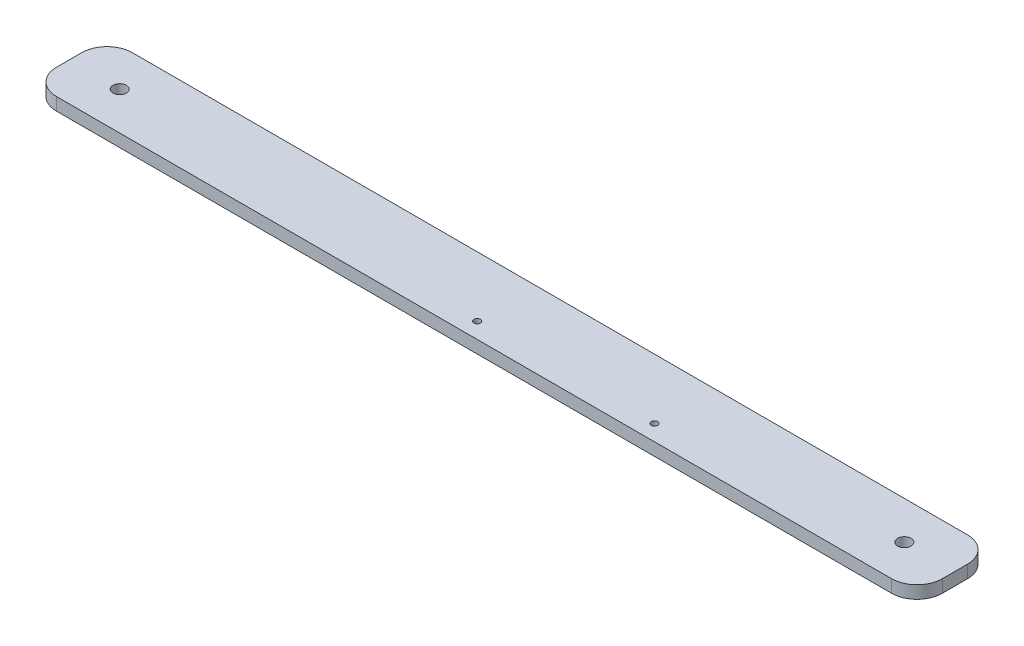
ISO-10303-21;
HEADER;
FILE_DESCRIPTION(('STEP AP214'),'2;1');
FILE_NAME('part.step','',(''),(''),'','','');
FILE_SCHEMA(('AUTOMOTIVE_DESIGN { 1 0 10303 214 1 1 1 1 }'));
ENDSEC;
DATA;
#1=APPLICATION_CONTEXT('core data for automotive mechanical design processes');
#2=APPLICATION_PROTOCOL_DEFINITION('international standard','automotive_design',2000,#1);
#3=PRODUCT_CONTEXT('',#1,'mechanical');
#4=PRODUCT('Part','Part','',(#3));
#5=PRODUCT_RELATED_PRODUCT_CATEGORY('part','',(#4));
#6=PRODUCT_DEFINITION_FORMATION('','',#4);
#7=PRODUCT_DEFINITION_CONTEXT('part definition',#1,'design');
#8=PRODUCT_DEFINITION('design','',#6,#7);
#9=PRODUCT_DEFINITION_SHAPE('','',#8);
#10=(LENGTH_UNIT() NAMED_UNIT(*) SI_UNIT(.MILLI.,.METRE.));
#11=(NAMED_UNIT(*) PLANE_ANGLE_UNIT() SI_UNIT($,.RADIAN.));
#12=(NAMED_UNIT(*) SI_UNIT($,.STERADIAN.) SOLID_ANGLE_UNIT());
#13=UNCERTAINTY_MEASURE_WITH_UNIT(LENGTH_MEASURE(1.E-05),#10,'distance_accuracy_value','');
#14=(GEOMETRIC_REPRESENTATION_CONTEXT(3) GLOBAL_UNCERTAINTY_ASSIGNED_CONTEXT((#13)) GLOBAL_UNIT_ASSIGNED_CONTEXT((#10,
#11,#12)) REPRESENTATION_CONTEXT('',''));
#15=CARTESIAN_POINT('',(0.,0.,0.));
#16=DIRECTION('',(0.,0.,1.));
#17=DIRECTION('',(1.,0.,0.));
#18=AXIS2_PLACEMENT_3D('',#15,#16,#17);
#19=CARTESIAN_POINT('',(431.8,6.35,-12.7));
#20=DIRECTION('',(0.,-1.,0.));
#21=DIRECTION('',(0.,0.,-1.));
#22=AXIS2_PLACEMENT_3D('',#19,#20,#21);
#23=CYLINDRICAL_SURFACE('',#22,12.7);
#24=DIRECTION('',(0.,-1.,0.));
#25=VECTOR('',#24,1.);
#26=CARTESIAN_POINT('',(444.5,6.35,-12.7));
#27=LINE('',#26,#25);
#28=CARTESIAN_POINT('',(444.5,6.35,-12.7));
#29=VERTEX_POINT('',#28);
#30=CARTESIAN_POINT('',(444.5,0.,-12.7));
#31=VERTEX_POINT('',#30);
#32=EDGE_CURVE('E176',#29,#31,#27,.T.);
#33=ORIENTED_EDGE('',*,*,#32,.F.);
#34=CARTESIAN_POINT('',(431.8,6.35,-12.7));
#35=DIRECTION('',(0.,-1.,0.));
#36=DIRECTION('',(0.,0.,-1.));
#37=AXIS2_PLACEMENT_3D('',#34,#35,#36);
#38=CIRCLE('',#37,12.7);
#39=CARTESIAN_POINT('',(431.8,6.35,0.));
#40=VERTEX_POINT('',#39);
#41=EDGE_CURVE('E48',#40,#29,#38,.F.);
#42=ORIENTED_EDGE('',*,*,#41,.F.);
#43=DIRECTION('',(0.,-1.,0.));
#44=VECTOR('',#43,1.);
#45=CARTESIAN_POINT('',(431.8,6.35,0.));
#46=LINE('',#45,#44);
#47=CARTESIAN_POINT('',(431.8,0.,0.));
#48=VERTEX_POINT('',#47);
#49=EDGE_CURVE('E180',#48,#40,#46,.F.);
#50=ORIENTED_EDGE('',*,*,#49,.F.);
#51=CARTESIAN_POINT('',(431.8,0.,-12.7));
#52=DIRECTION('',(0.,-1.,0.));
#53=DIRECTION('',(0.,0.,-1.));
#54=AXIS2_PLACEMENT_3D('',#51,#52,#53);
#55=CIRCLE('',#54,12.7);
#56=EDGE_CURVE('E11',#31,#48,#55,.T.);
#57=ORIENTED_EDGE('',*,*,#56,.F.);
#58=EDGE_LOOP('',(#33,#42,#50,#57));
#59=FACE_BOUND('',#58,.T.);
#60=ADVANCED_FACE('F40',(#59),#23,.T.);
#61=CARTESIAN_POINT('',(431.8,6.35,-25.4));
#62=DIRECTION('',(0.,-1.,0.));
#63=DIRECTION('',(0.,0.,-1.));
#64=AXIS2_PLACEMENT_3D('',#61,#62,#63);
#65=CYLINDRICAL_SURFACE('',#64,12.7);
#66=DIRECTION('',(0.,-1.,0.));
#67=VECTOR('',#66,1.);
#68=CARTESIAN_POINT('',(431.8,6.35,-38.1));
#69=LINE('',#68,#67);
#70=CARTESIAN_POINT('',(431.8,6.35,-38.1));
#71=VERTEX_POINT('',#70);
#72=CARTESIAN_POINT('',(431.8,0.,-38.1));
#73=VERTEX_POINT('',#72);
#74=EDGE_CURVE('E161',#71,#73,#69,.T.);
#75=ORIENTED_EDGE('',*,*,#74,.F.);
#76=CARTESIAN_POINT('',(431.8,6.35,-25.4));
#77=DIRECTION('',(0.,-1.,0.));
#78=DIRECTION('',(0.,0.,-1.));
#79=AXIS2_PLACEMENT_3D('',#76,#77,#78);
#80=CIRCLE('',#79,12.7);
#81=CARTESIAN_POINT('',(444.5,6.35,-25.4));
#82=VERTEX_POINT('',#81);
#83=EDGE_CURVE('E169',#82,#71,#80,.F.);
#84=ORIENTED_EDGE('',*,*,#83,.F.);
#85=DIRECTION('',(0.,-1.,0.));
#86=VECTOR('',#85,1.);
#87=CARTESIAN_POINT('',(444.5,6.35,-25.4));
#88=LINE('',#87,#86);
#89=CARTESIAN_POINT('',(444.5,0.,-25.4));
#90=VERTEX_POINT('',#89);
#91=EDGE_CURVE('E165',#90,#82,#88,.F.);
#92=ORIENTED_EDGE('',*,*,#91,.F.);
#93=CARTESIAN_POINT('',(431.8,0.,-25.4));
#94=DIRECTION('',(0.,-1.,0.));
#95=DIRECTION('',(0.,0.,-1.));
#96=AXIS2_PLACEMENT_3D('',#93,#94,#95);
#97=CIRCLE('',#96,12.7);
#98=EDGE_CURVE('E172',#73,#90,#97,.T.);
#99=ORIENTED_EDGE('',*,*,#98,.F.);
#100=EDGE_LOOP('',(#75,#84,#92,#99));
#101=FACE_BOUND('',#100,.T.);
#102=ADVANCED_FACE('F263',(#101),#65,.T.);
#103=CARTESIAN_POINT('',(12.7,6.35,-25.4));
#104=DIRECTION('',(0.,-1.,0.));
#105=DIRECTION('',(0.,0.,-1.));
#106=AXIS2_PLACEMENT_3D('',#103,#104,#105);
#107=CYLINDRICAL_SURFACE('',#106,12.7);
#108=DIRECTION('',(0.,-1.,0.));
#109=VECTOR('',#108,1.);
#110=CARTESIAN_POINT('',(0.,6.35,-25.4));
#111=LINE('',#110,#109);
#112=CARTESIAN_POINT('',(0.,6.35,-25.4));
#113=VERTEX_POINT('',#112);
#114=CARTESIAN_POINT('',(0.,0.,-25.4));
#115=VERTEX_POINT('',#114);
#116=EDGE_CURVE('E121',#113,#115,#111,.T.);
#117=ORIENTED_EDGE('',*,*,#116,.F.);
#118=CARTESIAN_POINT('',(12.7,6.35,-25.4));
#119=DIRECTION('',(0.,-1.,0.));
#120=DIRECTION('',(0.,0.,-1.));
#121=AXIS2_PLACEMENT_3D('',#118,#119,#120);
#122=CIRCLE('',#121,12.7);
#123=CARTESIAN_POINT('',(12.7,6.35,-38.1));
#124=VERTEX_POINT('',#123);
#125=EDGE_CURVE('E156',#124,#113,#122,.F.);
#126=ORIENTED_EDGE('',*,*,#125,.F.);
#127=DIRECTION('',(0.,-1.,0.));
#128=VECTOR('',#127,1.);
#129=CARTESIAN_POINT('',(12.7,6.35,-38.1));
#130=LINE('',#129,#128);
#131=CARTESIAN_POINT('',(12.7,0.,-38.1));
#132=VERTEX_POINT('',#131);
#133=EDGE_CURVE('E153',#132,#124,#130,.F.);
#134=ORIENTED_EDGE('',*,*,#133,.F.);
#135=CARTESIAN_POINT('',(12.7,0.,-25.4));
#136=DIRECTION('',(0.,-1.,0.));
#137=DIRECTION('',(0.,0.,-1.));
#138=AXIS2_PLACEMENT_3D('',#135,#136,#137);
#139=CIRCLE('',#138,12.7);
#140=EDGE_CURVE('E158',#115,#132,#139,.T.);
#141=ORIENTED_EDGE('',*,*,#140,.F.);
#142=EDGE_LOOP('',(#117,#126,#134,#141));
#143=FACE_BOUND('',#142,.T.);
#144=ADVANCED_FACE('F267',(#143),#107,.T.);
#145=CARTESIAN_POINT('',(12.7,6.35,-12.7));
#146=DIRECTION('',(0.,-1.,0.));
#147=DIRECTION('',(0.,0.,-1.));
#148=AXIS2_PLACEMENT_3D('',#145,#146,#147);
#149=CYLINDRICAL_SURFACE('',#148,12.7);
#150=DIRECTION('',(0.,-1.,0.));
#151=VECTOR('',#150,1.);
#152=CARTESIAN_POINT('',(12.7,6.35,0.));
#153=LINE('',#152,#151);
#154=CARTESIAN_POINT('',(12.7,6.35,0.));
#155=VERTEX_POINT('',#154);
#156=CARTESIAN_POINT('',(12.7,0.,0.));
#157=VERTEX_POINT('',#156);
#158=EDGE_CURVE('E116',#155,#157,#153,.T.);
#159=ORIENTED_EDGE('',*,*,#158,.F.);
#160=CARTESIAN_POINT('',(12.7,6.35,-12.7));
#161=DIRECTION('',(0.,-1.,0.));
#162=DIRECTION('',(0.,0.,-1.));
#163=AXIS2_PLACEMENT_3D('',#160,#161,#162);
#164=CIRCLE('',#163,12.7);
#165=CARTESIAN_POINT('',(0.,6.35,-12.7));
#166=VERTEX_POINT('',#165);
#167=EDGE_CURVE('E122',#166,#155,#164,.F.);
#168=ORIENTED_EDGE('',*,*,#167,.F.);
#169=DIRECTION('',(0.,-1.,0.));
#170=VECTOR('',#169,1.);
#171=CARTESIAN_POINT('',(0.,6.35,-12.7));
#172=LINE('',#171,#170);
#173=CARTESIAN_POINT('',(0.,0.,-12.7));
#174=VERTEX_POINT('',#173);
#175=EDGE_CURVE('E119',#174,#166,#172,.F.);
#176=ORIENTED_EDGE('',*,*,#175,.F.);
#177=CARTESIAN_POINT('',(12.7,0.,-12.7));
#178=DIRECTION('',(0.,-1.,0.));
#179=DIRECTION('',(0.,0.,-1.));
#180=AXIS2_PLACEMENT_3D('',#177,#178,#179);
#181=CIRCLE('',#180,12.7);
#182=EDGE_CURVE('E112',#157,#174,#181,.T.);
#183=ORIENTED_EDGE('',*,*,#182,.F.);
#184=EDGE_LOOP('',(#159,#168,#176,#183));
#185=FACE_BOUND('',#184,.T.);
#186=ADVANCED_FACE('F114',(#185),#149,.T.);
#187=CARTESIAN_POINT('',(0.,6.35,0.));
#188=DIRECTION('',(1.,0.,0.));
#189=DIRECTION('',(0.,0.,-1.));
#190=AXIS2_PLACEMENT_3D('',#187,#188,#189);
#191=PLANE('',#190);
#192=DIRECTION('',(0.,0.,1.));
#193=VECTOR('',#192,1.);
#194=CARTESIAN_POINT('',(0.,6.35,0.));
#195=LINE('',#194,#193);
#196=EDGE_CURVE('E147',#113,#166,#195,.T.);
#197=ORIENTED_EDGE('',*,*,#196,.F.);
#198=ORIENTED_EDGE('',*,*,#116,.T.);
#199=DIRECTION('',(0.,0.,1.));
#200=VECTOR('',#199,1.);
#201=CARTESIAN_POINT('',(0.,0.,0.));
#202=LINE('',#201,#200);
#203=EDGE_CURVE('E135',#115,#174,#202,.T.);
#204=ORIENTED_EDGE('',*,*,#203,.T.);
#205=ORIENTED_EDGE('',*,*,#175,.T.);
#206=EDGE_LOOP('',(#197,#198,#204,#205));
#207=FACE_BOUND('',#206,.T.);
#208=ADVANCED_FACE('F278',(#207),#191,.F.);
#209=CARTESIAN_POINT('',(0.,6.35,0.));
#210=DIRECTION('',(0.,0.,-1.));
#211=DIRECTION('',(-1.,0.,0.));
#212=AXIS2_PLACEMENT_3D('',#209,#210,#211);
#213=PLANE('',#212);
#214=DIRECTION('',(1.,0.,0.));
#215=VECTOR('',#214,1.);
#216=CARTESIAN_POINT('',(0.,0.,0.));
#217=LINE('',#216,#215);
#218=EDGE_CURVE('E127',#157,#48,#217,.T.);
#219=ORIENTED_EDGE('',*,*,#218,.T.);
#220=ORIENTED_EDGE('',*,*,#49,.T.);
#221=DIRECTION('',(1.,0.,0.));
#222=VECTOR('',#221,1.);
#223=CARTESIAN_POINT('',(0.,6.35,0.));
#224=LINE('',#223,#222);
#225=EDGE_CURVE('E129',#155,#40,#224,.T.);
#226=ORIENTED_EDGE('',*,*,#225,.F.);
#227=ORIENTED_EDGE('',*,*,#158,.T.);
#228=EDGE_LOOP('',(#219,#220,#226,#227));
#229=FACE_BOUND('',#228,.T.);
#230=ADVANCED_FACE('F126',(#229),#213,.F.);
#231=CARTESIAN_POINT('',(444.5,6.35,0.));
#232=DIRECTION('',(-1.,0.,0.));
#233=DIRECTION('',(0.,0.,1.));
#234=AXIS2_PLACEMENT_3D('',#231,#232,#233);
#235=PLANE('',#234);
#236=DIRECTION('',(0.,0.,-1.));
#237=VECTOR('',#236,1.);
#238=CARTESIAN_POINT('',(444.5,6.35,0.));
#239=LINE('',#238,#237);
#240=EDGE_CURVE('E187',#29,#82,#239,.T.);
#241=ORIENTED_EDGE('',*,*,#240,.F.);
#242=ORIENTED_EDGE('',*,*,#32,.T.);
#243=DIRECTION('',(0.,0.,-1.));
#244=VECTOR('',#243,1.);
#245=CARTESIAN_POINT('',(444.5,0.,0.));
#246=LINE('',#245,#244);
#247=EDGE_CURVE('E134',#31,#90,#246,.T.);
#248=ORIENTED_EDGE('',*,*,#247,.T.);
#249=ORIENTED_EDGE('',*,*,#91,.T.);
#250=EDGE_LOOP('',(#241,#242,#248,#249));
#251=FACE_BOUND('',#250,.T.);
#252=ADVANCED_FACE('F190',(#251),#235,.F.);
#253=CARTESIAN_POINT('',(0.,6.35,-38.1));
#254=DIRECTION('',(0.,0.,1.));
#255=DIRECTION('',(1.,0.,0.));
#256=AXIS2_PLACEMENT_3D('',#253,#254,#255);
#257=PLANE('',#256);
#258=DIRECTION('',(-1.,0.,0.));
#259=VECTOR('',#258,1.);
#260=CARTESIAN_POINT('',(0.,6.35,-38.1));
#261=LINE('',#260,#259);
#262=EDGE_CURVE('E130',#71,#124,#261,.T.);
#263=ORIENTED_EDGE('',*,*,#262,.F.);
#264=ORIENTED_EDGE('',*,*,#74,.T.);
#265=DIRECTION('',(-1.,0.,0.));
#266=VECTOR('',#265,1.);
#267=CARTESIAN_POINT('',(0.,0.,-38.1));
#268=LINE('',#267,#266);
#269=EDGE_CURVE('E140',#73,#132,#268,.T.);
#270=ORIENTED_EDGE('',*,*,#269,.T.);
#271=ORIENTED_EDGE('',*,*,#133,.T.);
#272=EDGE_LOOP('',(#263,#264,#270,#271));
#273=FACE_BOUND('',#272,.T.);
#274=ADVANCED_FACE('F253',(#273),#257,.F.);
#275=CARTESIAN_POINT('',(0.,6.35,0.));
#276=DIRECTION('',(0.,-1.,0.));
#277=DIRECTION('',(0.,0.,-1.));
#278=AXIS2_PLACEMENT_3D('',#275,#276,#277);
#279=PLANE('',#278);
#280=CARTESIAN_POINT('',(304.8,6.35,-7.93749999999983));
#281=DIRECTION('',(0.,-1.,0.));
#282=DIRECTION('',(0.,0.,-1.));
#283=AXIS2_PLACEMENT_3D('',#280,#281,#282);
#284=CIRCLE('',#283,1.63194999999999);
#285=CARTESIAN_POINT('',(304.8,6.35,-9.56944999999983));
#286=VERTEX_POINT('',#285);
#287=EDGE_CURVE('E221',#286,#286,#284,.T.);
#288=ORIENTED_EDGE('',*,*,#287,.T.);
#289=EDGE_LOOP('',(#288));
#290=FACE_BOUND('',#289,.T.);
#291=CARTESIAN_POINT('',(215.9,6.35,-7.93750000000008));
#292=DIRECTION('',(0.,-1.,0.));
#293=DIRECTION('',(0.,0.,-1.));
#294=AXIS2_PLACEMENT_3D('',#291,#292,#293);
#295=CIRCLE('',#294,1.63194999999999);
#296=CARTESIAN_POINT('',(215.9,6.35,-9.56945000000008));
#297=VERTEX_POINT('',#296);
#298=EDGE_CURVE('E207',#297,#297,#295,.T.);
#299=ORIENTED_EDGE('',*,*,#298,.T.);
#300=EDGE_LOOP('',(#299));
#301=FACE_BOUND('',#300,.T.);
#302=CARTESIAN_POINT('',(419.1,6.35,-19.05));
#303=DIRECTION('',(0.,1.,0.));
#304=DIRECTION('',(0.,0.,1.));
#305=AXIS2_PLACEMENT_3D('',#302,#303,#304);
#306=CIRCLE('',#305,3.37819999999999);
#307=CARTESIAN_POINT('',(419.1,6.35,-15.6718));
#308=VERTEX_POINT('',#307);
#309=EDGE_CURVE('E203',#308,#308,#306,.T.);
#310=ORIENTED_EDGE('',*,*,#309,.F.);
#311=EDGE_LOOP('',(#310));
#312=FACE_BOUND('',#311,.T.);
#313=CARTESIAN_POINT('',(25.4,6.35,-19.05));
#314=DIRECTION('',(0.,1.,0.));
#315=DIRECTION('',(0.,0.,1.));
#316=AXIS2_PLACEMENT_3D('',#313,#314,#315);
#317=CIRCLE('',#316,3.3782);
#318=CARTESIAN_POINT('',(25.4,6.35,-15.6718));
#319=VERTEX_POINT('',#318);
#320=EDGE_CURVE('E197',#319,#319,#317,.T.);
#321=ORIENTED_EDGE('',*,*,#320,.F.);
#322=EDGE_LOOP('',(#321));
#323=FACE_BOUND('',#322,.T.);
#324=ORIENTED_EDGE('',*,*,#225,.T.);
#325=ORIENTED_EDGE('',*,*,#41,.T.);
#326=ORIENTED_EDGE('',*,*,#240,.T.);
#327=ORIENTED_EDGE('',*,*,#83,.T.);
#328=ORIENTED_EDGE('',*,*,#262,.T.);
#329=ORIENTED_EDGE('',*,*,#125,.T.);
#330=ORIENTED_EDGE('',*,*,#196,.T.);
#331=ORIENTED_EDGE('',*,*,#167,.T.);
#332=EDGE_LOOP('',(#324,#325,#326,#327,#328,#329,#330,#331));
#333=FACE_BOUND('',#332,.T.);
#334=ADVANCED_FACE('F185',(#290,#301,#312,#323,#333),#279,.F.);
#335=CARTESIAN_POINT('',(0.,0.,0.));
#336=DIRECTION('',(0.,-1.,0.));
#337=DIRECTION('',(0.,0.,-1.));
#338=AXIS2_PLACEMENT_3D('',#335,#336,#337);
#339=PLANE('',#338);
#340=CARTESIAN_POINT('',(304.8,0.,-7.93749999999983));
#341=DIRECTION('',(0.,-1.,0.));
#342=DIRECTION('',(0.,0.,-1.));
#343=AXIS2_PLACEMENT_3D('',#340,#341,#342);
#344=CIRCLE('',#343,2.85750000000001);
#345=CARTESIAN_POINT('',(304.8,0.,-10.7949999999998));
#346=VERTEX_POINT('',#345);
#347=EDGE_CURVE('E229',#346,#346,#344,.T.);
#348=ORIENTED_EDGE('',*,*,#347,.F.);
#349=EDGE_LOOP('',(#348));
#350=FACE_BOUND('',#349,.T.);
#351=CARTESIAN_POINT('',(215.9,0.,-7.93750000000008));
#352=DIRECTION('',(0.,-1.,0.));
#353=DIRECTION('',(0.,0.,-1.));
#354=AXIS2_PLACEMENT_3D('',#351,#352,#353);
#355=CIRCLE('',#354,2.85749999999998);
#356=CARTESIAN_POINT('',(215.9,0.,-10.7950000000001));
#357=VERTEX_POINT('',#356);
#358=EDGE_CURVE('E217',#357,#357,#355,.T.);
#359=ORIENTED_EDGE('',*,*,#358,.F.);
#360=EDGE_LOOP('',(#359));
#361=FACE_BOUND('',#360,.T.);
#362=CARTESIAN_POINT('',(419.1,0.,-19.05));
#363=DIRECTION('',(0.,1.,0.));
#364=DIRECTION('',(0.,0.,1.));
#365=AXIS2_PLACEMENT_3D('',#362,#363,#364);
#366=CIRCLE('',#365,3.37819999999999);
#367=CARTESIAN_POINT('',(419.1,0.,-15.6718));
#368=VERTEX_POINT('',#367);
#369=EDGE_CURVE('E200',#368,#368,#366,.T.);
#370=ORIENTED_EDGE('',*,*,#369,.T.);
#371=EDGE_LOOP('',(#370));
#372=FACE_BOUND('',#371,.T.);
#373=CARTESIAN_POINT('',(25.4,0.,-19.05));
#374=DIRECTION('',(0.,1.,0.));
#375=DIRECTION('',(0.,0.,1.));
#376=AXIS2_PLACEMENT_3D('',#373,#374,#375);
#377=CIRCLE('',#376,3.3782);
#378=CARTESIAN_POINT('',(25.4,0.,-15.6718));
#379=VERTEX_POINT('',#378);
#380=EDGE_CURVE('E142',#379,#379,#377,.T.);
#381=ORIENTED_EDGE('',*,*,#380,.T.);
#382=EDGE_LOOP('',(#381));
#383=FACE_BOUND('',#382,.T.);
#384=ORIENTED_EDGE('',*,*,#247,.F.);
#385=ORIENTED_EDGE('',*,*,#56,.T.);
#386=ORIENTED_EDGE('',*,*,#218,.F.);
#387=ORIENTED_EDGE('',*,*,#182,.T.);
#388=ORIENTED_EDGE('',*,*,#203,.F.);
#389=ORIENTED_EDGE('',*,*,#140,.T.);
#390=ORIENTED_EDGE('',*,*,#269,.F.);
#391=ORIENTED_EDGE('',*,*,#98,.T.);
#392=EDGE_LOOP('',(#384,#385,#386,#387,#388,#389,#390,#391));
#393=FACE_BOUND('',#392,.T.);
#394=ADVANCED_FACE('F132',(#350,#361,#372,#383,#393),#339,.T.);
#395=CARTESIAN_POINT('',(25.4,0.,-19.05));
#396=DIRECTION('',(0.,1.,0.));
#397=DIRECTION('',(0.,0.,1.));
#398=AXIS2_PLACEMENT_3D('',#395,#396,#397);
#399=CYLINDRICAL_SURFACE('',#398,3.3782);
#400=ORIENTED_EDGE('',*,*,#380,.F.);
#401=EDGE_LOOP('',(#400));
#402=FACE_BOUND('',#401,.T.);
#403=ORIENTED_EDGE('',*,*,#320,.T.);
#404=EDGE_LOOP('',(#403));
#405=FACE_BOUND('',#404,.T.);
#406=ADVANCED_FACE('F238',(#402,#405),#399,.F.);
#407=CARTESIAN_POINT('',(419.1,0.,-19.05));
#408=DIRECTION('',(0.,1.,0.));
#409=DIRECTION('',(0.,0.,1.));
#410=AXIS2_PLACEMENT_3D('',#407,#408,#409);
#411=CYLINDRICAL_SURFACE('',#410,3.37819999999999);
#412=ORIENTED_EDGE('',*,*,#369,.F.);
#413=EDGE_LOOP('',(#412));
#414=FACE_BOUND('',#413,.T.);
#415=ORIENTED_EDGE('',*,*,#309,.T.);
#416=EDGE_LOOP('',(#415));
#417=FACE_BOUND('',#416,.T.);
#418=ADVANCED_FACE('F248',(#414,#417),#411,.F.);
#419=CARTESIAN_POINT('',(215.9,0.,-7.93750000000008));
#420=DIRECTION('',(0.,-1.,0.));
#421=DIRECTION('',(0.,0.,-1.));
#422=AXIS2_PLACEMENT_3D('',#419,#420,#421);
#423=CYLINDRICAL_SURFACE('',#422,1.63194999999999);
#424=ORIENTED_EDGE('',*,*,#298,.F.);
#425=EDGE_LOOP('',(#424));
#426=FACE_BOUND('',#425,.T.);
#427=CARTESIAN_POINT('',(215.9,1.40983400146974,-7.93750000000008));
#428=DIRECTION('',(0.,-1.,0.));
#429=DIRECTION('',(0.,0.,-1.));
#430=AXIS2_PLACEMENT_3D('',#427,#428,#429);
#431=CIRCLE('',#430,1.63194999999999);
#432=CARTESIAN_POINT('',(215.9,1.40983400146974,-9.56945000000008));
#433=VERTEX_POINT('',#432);
#434=EDGE_CURVE('E213',#433,#433,#431,.T.);
#435=ORIENTED_EDGE('',*,*,#434,.T.);
#436=EDGE_LOOP('',(#435));
#437=FACE_BOUND('',#436,.T.);
#438=ADVANCED_FACE('F318',(#426,#437),#423,.F.);
#439=CARTESIAN_POINT('',(215.9,0.,-7.93750000000008));
#440=DIRECTION('',(0.,-1.,0.));
#441=DIRECTION('',(0.,0.,-1.));
#442=AXIS2_PLACEMENT_3D('',#439,#440,#441);
#443=CONICAL_SURFACE('',#442,2.85749999999998,0.71558499331766);
#444=ORIENTED_EDGE('',*,*,#434,.F.);
#445=EDGE_LOOP('',(#444));
#446=FACE_BOUND('',#445,.T.);
#447=ORIENTED_EDGE('',*,*,#358,.T.);
#448=EDGE_LOOP('',(#447));
#449=FACE_BOUND('',#448,.T.);
#450=ADVANCED_FACE('F325',(#446,#449),#443,.F.);
#451=CARTESIAN_POINT('',(304.8,0.,-7.93749999999983));
#452=DIRECTION('',(0.,-1.,0.));
#453=DIRECTION('',(0.,0.,-1.));
#454=AXIS2_PLACEMENT_3D('',#451,#452,#453);
#455=CYLINDRICAL_SURFACE('',#454,1.63194999999999);
#456=ORIENTED_EDGE('',*,*,#287,.F.);
#457=EDGE_LOOP('',(#456));
#458=FACE_BOUND('',#457,.T.);
#459=CARTESIAN_POINT('',(304.8,1.40983400146974,-7.93749999999983));
#460=DIRECTION('',(0.,-1.,0.));
#461=DIRECTION('',(0.,0.,-1.));
#462=AXIS2_PLACEMENT_3D('',#459,#460,#461);
#463=CIRCLE('',#462,1.63194999999999);
#464=CARTESIAN_POINT('',(304.8,1.40983400146974,-9.56944999999983));
#465=VERTEX_POINT('',#464);
#466=EDGE_CURVE('E225',#465,#465,#463,.T.);
#467=ORIENTED_EDGE('',*,*,#466,.T.);
#468=EDGE_LOOP('',(#467));
#469=FACE_BOUND('',#468,.T.);
#470=ADVANCED_FACE('F333',(#458,#469),#455,.F.);
#471=CARTESIAN_POINT('',(304.8,0.,-7.93749999999983));
#472=DIRECTION('',(0.,-1.,0.));
#473=DIRECTION('',(0.,0.,-1.));
#474=AXIS2_PLACEMENT_3D('',#471,#472,#473);
#475=CONICAL_SURFACE('',#474,2.85750000000001,0.715584993317671);
#476=ORIENTED_EDGE('',*,*,#466,.F.);
#477=EDGE_LOOP('',(#476));
#478=FACE_BOUND('',#477,.T.);
#479=ORIENTED_EDGE('',*,*,#347,.T.);
#480=EDGE_LOOP('',(#479));
#481=FACE_BOUND('',#480,.T.);
#482=ADVANCED_FACE('F234',(#478,#481),#475,.F.);
#483=CLOSED_SHELL('',(#60,#102,#144,#186,#208,#230,#252,#274,#334,#394,#406,#418,#438,#450,#470,#482));
#484=MANIFOLD_SOLID_BREP('B2',#483);
#485=ADVANCED_BREP_SHAPE_REPRESENTATION('',(#18,#484),#14);
#486=SHAPE_DEFINITION_REPRESENTATION(#9,#485);
ENDSEC;
END-ISO-10303-21;
